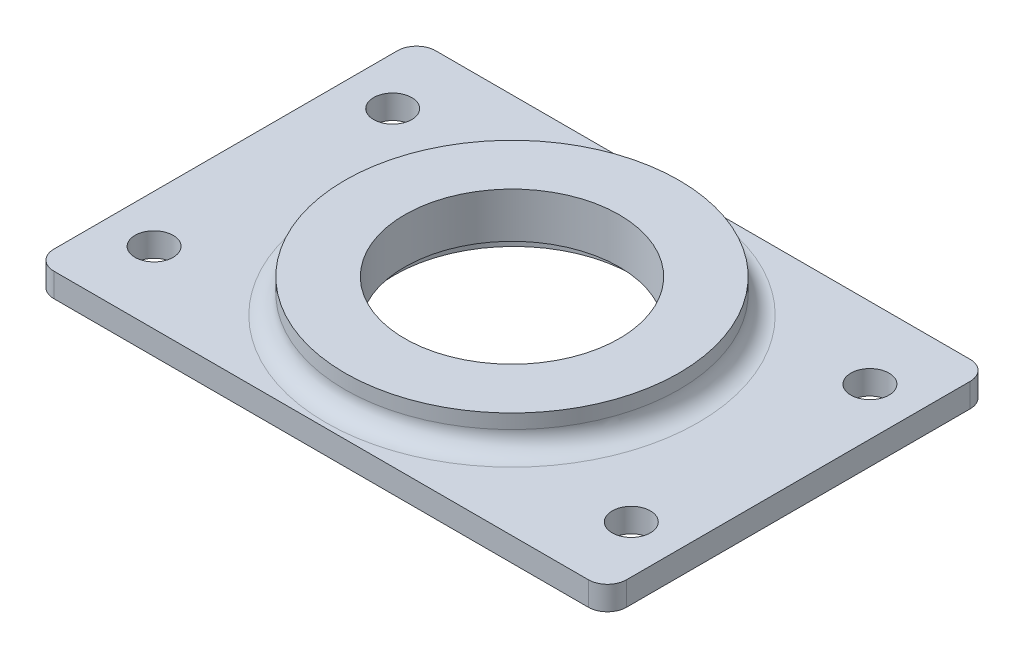
ISO-10303-21;
HEADER;
FILE_DESCRIPTION(('STEP AP214'),'2;1');
FILE_NAME('part.step','',(''),(''),'','','');
FILE_SCHEMA(('AUTOMOTIVE_DESIGN { 1 0 10303 214 1 1 1 1 }'));
ENDSEC;
DATA;
#1=APPLICATION_CONTEXT('core data for automotive mechanical design processes');
#2=APPLICATION_PROTOCOL_DEFINITION('international standard','automotive_design',2000,#1);
#3=PRODUCT_CONTEXT('',#1,'mechanical');
#4=PRODUCT('Part','Part','',(#3));
#5=PRODUCT_RELATED_PRODUCT_CATEGORY('part','',(#4));
#6=PRODUCT_DEFINITION_FORMATION('','',#4);
#7=PRODUCT_DEFINITION_CONTEXT('part definition',#1,'design');
#8=PRODUCT_DEFINITION('design','',#6,#7);
#9=PRODUCT_DEFINITION_SHAPE('','',#8);
#10=(LENGTH_UNIT() NAMED_UNIT(*) SI_UNIT(.MILLI.,.METRE.));
#11=(NAMED_UNIT(*) PLANE_ANGLE_UNIT() SI_UNIT($,.RADIAN.));
#12=(NAMED_UNIT(*) SI_UNIT($,.STERADIAN.) SOLID_ANGLE_UNIT());
#13=UNCERTAINTY_MEASURE_WITH_UNIT(LENGTH_MEASURE(1.E-05),#10,'distance_accuracy_value','');
#14=(GEOMETRIC_REPRESENTATION_CONTEXT(3) GLOBAL_UNCERTAINTY_ASSIGNED_CONTEXT((#13)) GLOBAL_UNIT_ASSIGNED_CONTEXT((#10,
#11,#12)) REPRESENTATION_CONTEXT('',''));
#15=CARTESIAN_POINT('',(0.,0.,0.));
#16=DIRECTION('',(0.,0.,1.));
#17=DIRECTION('',(1.,0.,0.));
#18=AXIS2_PLACEMENT_3D('',#15,#16,#17);
#19=CARTESIAN_POINT('',(38.1,3.175,-25.4));
#20=DIRECTION('',(0.,-1.,0.));
#21=DIRECTION('',(0.,0.,-1.));
#22=AXIS2_PLACEMENT_3D('',#19,#20,#21);
#23=CYLINDRICAL_SURFACE('',#22,14.2748);
#24=CARTESIAN_POINT('',(38.1,7.62,-25.4));
#25=DIRECTION('',(0.,-1.,0.));
#26=DIRECTION('',(0.,0.,-1.));
#27=AXIS2_PLACEMENT_3D('',#24,#25,#26);
#28=CIRCLE('',#27,14.2748);
#29=CARTESIAN_POINT('',(38.1,7.62,-39.6748));
#30=VERTEX_POINT('',#29);
#31=EDGE_CURVE('E135',#30,#30,#28,.T.);
#32=ORIENTED_EDGE('',*,*,#31,.F.);
#33=EDGE_LOOP('',(#32));
#34=FACE_BOUND('',#33,.T.);
#35=CARTESIAN_POINT('',(38.1,1.6002,-25.4));
#36=DIRECTION('',(0.,-1.,0.));
#37=DIRECTION('',(0.,0.,-1.));
#38=AXIS2_PLACEMENT_3D('',#35,#36,#37);
#39=CIRCLE('',#38,14.2748);
#40=CARTESIAN_POINT('',(38.1,1.6002,-39.6748));
#41=VERTEX_POINT('',#40);
#42=EDGE_CURVE('E144',#41,#41,#39,.T.);
#43=ORIENTED_EDGE('',*,*,#42,.T.);
#44=EDGE_LOOP('',(#43));
#45=FACE_BOUND('',#44,.T.);
#46=ADVANCED_FACE('F34',(#34,#45),#23,.F.);
#47=CARTESIAN_POINT('',(0.,3.175,0.));
#48=DIRECTION('',(0.,-1.,0.));
#49=DIRECTION('',(0.,0.,-1.));
#50=AXIS2_PLACEMENT_3D('',#47,#48,#49);
#51=PLANE('',#50);
#52=CARTESIAN_POINT('',(6.35,3.175,-41.275));
#53=DIRECTION('',(0.,1.,0.));
#54=DIRECTION('',(0.,0.,1.));
#55=AXIS2_PLACEMENT_3D('',#52,#53,#54);
#56=CIRCLE('',#55,2.54);
#57=CARTESIAN_POINT('',(6.35,3.175,-38.735));
#58=VERTEX_POINT('',#57);
#59=EDGE_CURVE('E209',#58,#58,#56,.T.);
#60=ORIENTED_EDGE('',*,*,#59,.F.);
#61=EDGE_LOOP('',(#60));
#62=FACE_BOUND('',#61,.T.);
#63=CARTESIAN_POINT('',(6.35,3.175,-9.525));
#64=DIRECTION('',(0.,1.,0.));
#65=DIRECTION('',(0.,0.,1.));
#66=AXIS2_PLACEMENT_3D('',#63,#64,#65);
#67=CIRCLE('',#66,2.54);
#68=CARTESIAN_POINT('',(6.35,3.175,-6.985));
#69=VERTEX_POINT('',#68);
#70=EDGE_CURVE('E215',#69,#69,#67,.T.);
#71=ORIENTED_EDGE('',*,*,#70,.F.);
#72=EDGE_LOOP('',(#71));
#73=FACE_BOUND('',#72,.T.);
#74=CARTESIAN_POINT('',(69.85,3.175,-9.525));
#75=DIRECTION('',(0.,1.,0.));
#76=DIRECTION('',(0.,0.,1.));
#77=AXIS2_PLACEMENT_3D('',#74,#75,#76);
#78=CIRCLE('',#77,2.54);
#79=CARTESIAN_POINT('',(69.85,3.175,-6.985));
#80=VERTEX_POINT('',#79);
#81=EDGE_CURVE('E221',#80,#80,#78,.T.);
#82=ORIENTED_EDGE('',*,*,#81,.F.);
#83=EDGE_LOOP('',(#82));
#84=FACE_BOUND('',#83,.T.);
#85=CARTESIAN_POINT('',(69.85,3.175,-41.275));
#86=DIRECTION('',(0.,1.,0.));
#87=DIRECTION('',(0.,0.,1.));
#88=AXIS2_PLACEMENT_3D('',#85,#86,#87);
#89=CIRCLE('',#88,2.54);
#90=CARTESIAN_POINT('',(69.85,3.175,-38.735));
#91=VERTEX_POINT('',#90);
#92=EDGE_CURVE('E203',#91,#91,#89,.T.);
#93=ORIENTED_EDGE('',*,*,#92,.F.);
#94=EDGE_LOOP('',(#93));
#95=FACE_BOUND('',#94,.T.);
#96=CARTESIAN_POINT('',(38.1,3.175,-25.4));
#97=DIRECTION('',(0.,-1.,0.));
#98=DIRECTION('',(0.,0.,-1.));
#99=AXIS2_PLACEMENT_3D('',#96,#97,#98);
#100=CIRCLE('',#99,24.765);
#101=CARTESIAN_POINT('',(38.1,3.175,-50.165));
#102=VERTEX_POINT('',#101);
#103=EDGE_CURVE('E151',#102,#102,#100,.T.);
#104=ORIENTED_EDGE('',*,*,#103,.T.);
#105=EDGE_LOOP('',(#104));
#106=FACE_BOUND('',#105,.T.);
#107=DIRECTION('',(-1.,0.,0.));
#108=VECTOR('',#107,1.);
#109=CARTESIAN_POINT('',(0.,3.175,-50.8));
#110=LINE('',#109,#108);
#111=CARTESIAN_POINT('',(73.66,3.175,-50.8));
#112=VERTEX_POINT('',#111);
#113=CARTESIAN_POINT('',(2.54,3.175,-50.8));
#114=VERTEX_POINT('',#113);
#115=EDGE_CURVE('E138',#112,#114,#110,.T.);
#116=ORIENTED_EDGE('',*,*,#115,.T.);
#117=CARTESIAN_POINT('',(2.54,3.175,-48.26));
#118=DIRECTION('',(0.,-1.,0.));
#119=DIRECTION('',(0.,0.,-1.));
#120=AXIS2_PLACEMENT_3D('',#117,#118,#119);
#121=CIRCLE('',#120,2.54);
#122=CARTESIAN_POINT('',(0.,3.175,-48.26));
#123=VERTEX_POINT('',#122);
#124=EDGE_CURVE('E166',#114,#123,#121,.F.);
#125=ORIENTED_EDGE('',*,*,#124,.T.);
#126=DIRECTION('',(0.,0.,1.));
#127=VECTOR('',#126,1.);
#128=CARTESIAN_POINT('',(0.,3.175,0.));
#129=LINE('',#128,#127);
#130=CARTESIAN_POINT('',(0.,3.175,-2.54));
#131=VERTEX_POINT('',#130);
#132=EDGE_CURVE('E121',#123,#131,#129,.T.);
#133=ORIENTED_EDGE('',*,*,#132,.T.);
#134=CARTESIAN_POINT('',(2.54,3.175,-2.54));
#135=DIRECTION('',(0.,-1.,0.));
#136=DIRECTION('',(0.,0.,-1.));
#137=AXIS2_PLACEMENT_3D('',#134,#135,#136);
#138=CIRCLE('',#137,2.54);
#139=CARTESIAN_POINT('',(2.54,3.175,0.));
#140=VERTEX_POINT('',#139);
#141=EDGE_CURVE('E162',#131,#140,#138,.F.);
#142=ORIENTED_EDGE('',*,*,#141,.T.);
#143=DIRECTION('',(1.,0.,0.));
#144=VECTOR('',#143,1.);
#145=CARTESIAN_POINT('',(0.,3.175,0.));
#146=LINE('',#145,#144);
#147=CARTESIAN_POINT('',(73.66,3.175,0.));
#148=VERTEX_POINT('',#147);
#149=EDGE_CURVE('E175',#140,#148,#146,.T.);
#150=ORIENTED_EDGE('',*,*,#149,.T.);
#151=CARTESIAN_POINT('',(73.66,3.175,-2.54));
#152=DIRECTION('',(0.,-1.,0.));
#153=DIRECTION('',(0.,0.,-1.));
#154=AXIS2_PLACEMENT_3D('',#151,#152,#153);
#155=CIRCLE('',#154,2.54);
#156=CARTESIAN_POINT('',(76.2,3.175,-2.54));
#157=VERTEX_POINT('',#156);
#158=EDGE_CURVE('E56',#148,#157,#155,.F.);
#159=ORIENTED_EDGE('',*,*,#158,.T.);
#160=DIRECTION('',(0.,0.,-1.));
#161=VECTOR('',#160,1.);
#162=CARTESIAN_POINT('',(76.2,3.175,0.));
#163=LINE('',#162,#161);
#164=CARTESIAN_POINT('',(76.2,3.175,-48.26));
#165=VERTEX_POINT('',#164);
#166=EDGE_CURVE('E181',#157,#165,#163,.T.);
#167=ORIENTED_EDGE('',*,*,#166,.T.);
#168=CARTESIAN_POINT('',(73.66,3.175,-48.26));
#169=DIRECTION('',(0.,-1.,0.));
#170=DIRECTION('',(0.,0.,-1.));
#171=AXIS2_PLACEMENT_3D('',#168,#169,#170);
#172=CIRCLE('',#171,2.54);
#173=EDGE_CURVE('E164',#165,#112,#172,.F.);
#174=ORIENTED_EDGE('',*,*,#173,.T.);
#175=EDGE_LOOP('',(#116,#125,#133,#142,#150,#159,#167,#174));
#176=FACE_BOUND('',#175,.T.);
#177=ADVANCED_FACE('F179',(#62,#73,#84,#95,#106,#176),#51,.F.);
#178=CARTESIAN_POINT('',(0.,0.,0.));
#179=DIRECTION('',(0.,-1.,0.));
#180=DIRECTION('',(0.,0.,-1.));
#181=AXIS2_PLACEMENT_3D('',#178,#179,#180);
#182=PLANE('',#181);
#183=CARTESIAN_POINT('',(6.35,0.,-41.275));
#184=DIRECTION('',(0.,1.,0.));
#185=DIRECTION('',(0.,0.,1.));
#186=AXIS2_PLACEMENT_3D('',#183,#184,#185);
#187=CIRCLE('',#186,2.54);
#188=CARTESIAN_POINT('',(6.35,0.,-38.735));
#189=VERTEX_POINT('',#188);
#190=EDGE_CURVE('E212',#189,#189,#187,.T.);
#191=ORIENTED_EDGE('',*,*,#190,.T.);
#192=EDGE_LOOP('',(#191));
#193=FACE_BOUND('',#192,.T.);
#194=CARTESIAN_POINT('',(6.35,0.,-9.525));
#195=DIRECTION('',(0.,1.,0.));
#196=DIRECTION('',(0.,0.,1.));
#197=AXIS2_PLACEMENT_3D('',#194,#195,#196);
#198=CIRCLE('',#197,2.54);
#199=CARTESIAN_POINT('',(6.35,0.,-6.985));
#200=VERTEX_POINT('',#199);
#201=EDGE_CURVE('E218',#200,#200,#198,.T.);
#202=ORIENTED_EDGE('',*,*,#201,.T.);
#203=EDGE_LOOP('',(#202));
#204=FACE_BOUND('',#203,.T.);
#205=CARTESIAN_POINT('',(69.85,0.,-9.525));
#206=DIRECTION('',(0.,1.,0.));
#207=DIRECTION('',(0.,0.,1.));
#208=AXIS2_PLACEMENT_3D('',#205,#206,#207);
#209=CIRCLE('',#208,2.54);
#210=CARTESIAN_POINT('',(69.85,0.,-6.985));
#211=VERTEX_POINT('',#210);
#212=EDGE_CURVE('E206',#211,#211,#209,.T.);
#213=ORIENTED_EDGE('',*,*,#212,.T.);
#214=EDGE_LOOP('',(#213));
#215=FACE_BOUND('',#214,.T.);
#216=CARTESIAN_POINT('',(69.85,0.,-41.275));
#217=DIRECTION('',(0.,1.,0.));
#218=DIRECTION('',(0.,0.,1.));
#219=AXIS2_PLACEMENT_3D('',#216,#217,#218);
#220=CIRCLE('',#219,2.54);
#221=CARTESIAN_POINT('',(69.85,0.,-38.735));
#222=VERTEX_POINT('',#221);
#223=EDGE_CURVE('E200',#222,#222,#220,.T.);
#224=ORIENTED_EDGE('',*,*,#223,.T.);
#225=EDGE_LOOP('',(#224));
#226=FACE_BOUND('',#225,.T.);
#227=CARTESIAN_POINT('',(38.3325078490202,0.,-25.4));
#228=DIRECTION('',(0.,-1.,0.));
#229=DIRECTION('',(0.,0.,-1.));
#230=AXIS2_PLACEMENT_3D('',#227,#228,#229);
#231=CIRCLE('',#230,15.8623);
#232=CARTESIAN_POINT('',(38.3325078490202,0.,-41.2623));
#233=VERTEX_POINT('',#232);
#234=EDGE_CURVE('E197',#233,#233,#231,.T.);
#235=ORIENTED_EDGE('',*,*,#234,.F.);
#236=EDGE_LOOP('',(#235));
#237=FACE_BOUND('',#236,.T.);
#238=DIRECTION('',(0.,0.,1.));
#239=VECTOR('',#238,1.);
#240=CARTESIAN_POINT('',(0.,0.,0.));
#241=LINE('',#240,#239);
#242=CARTESIAN_POINT('',(0.,0.,-48.26));
#243=VERTEX_POINT('',#242);
#244=CARTESIAN_POINT('',(0.,0.,-2.54));
#245=VERTEX_POINT('',#244);
#246=EDGE_CURVE('E118',#243,#245,#241,.T.);
#247=ORIENTED_EDGE('',*,*,#246,.F.);
#248=CARTESIAN_POINT('',(2.54,0.,-48.26));
#249=DIRECTION('',(0.,-1.,0.));
#250=DIRECTION('',(0.,0.,-1.));
#251=AXIS2_PLACEMENT_3D('',#248,#249,#250);
#252=CIRCLE('',#251,2.54);
#253=CARTESIAN_POINT('',(2.54,0.,-50.8));
#254=VERTEX_POINT('',#253);
#255=EDGE_CURVE('E101',#243,#254,#252,.T.);
#256=ORIENTED_EDGE('',*,*,#255,.T.);
#257=DIRECTION('',(-1.,0.,0.));
#258=VECTOR('',#257,1.);
#259=CARTESIAN_POINT('',(0.,0.,-50.8));
#260=LINE('',#259,#258);
#261=CARTESIAN_POINT('',(73.66,0.,-50.8));
#262=VERTEX_POINT('',#261);
#263=EDGE_CURVE('E142',#262,#254,#260,.T.);
#264=ORIENTED_EDGE('',*,*,#263,.F.);
#265=CARTESIAN_POINT('',(73.66,0.,-48.26));
#266=DIRECTION('',(0.,-1.,0.));
#267=DIRECTION('',(0.,0.,-1.));
#268=AXIS2_PLACEMENT_3D('',#265,#266,#267);
#269=CIRCLE('',#268,2.54);
#270=CARTESIAN_POINT('',(76.2,0.,-48.26));
#271=VERTEX_POINT('',#270);
#272=EDGE_CURVE('E112',#262,#271,#269,.T.);
#273=ORIENTED_EDGE('',*,*,#272,.T.);
#274=DIRECTION('',(0.,0.,-1.));
#275=VECTOR('',#274,1.);
#276=CARTESIAN_POINT('',(76.2,0.,0.));
#277=LINE('',#276,#275);
#278=CARTESIAN_POINT('',(76.2,0.,-2.54));
#279=VERTEX_POINT('',#278);
#280=EDGE_CURVE('E132',#279,#271,#277,.T.);
#281=ORIENTED_EDGE('',*,*,#280,.F.);
#282=CARTESIAN_POINT('',(73.66,0.,-2.54));
#283=DIRECTION('',(0.,-1.,0.));
#284=DIRECTION('',(0.,0.,-1.));
#285=AXIS2_PLACEMENT_3D('',#282,#283,#284);
#286=CIRCLE('',#285,2.54);
#287=CARTESIAN_POINT('',(73.66,0.,0.));
#288=VERTEX_POINT('',#287);
#289=EDGE_CURVE('E122',#279,#288,#286,.T.);
#290=ORIENTED_EDGE('',*,*,#289,.T.);
#291=DIRECTION('',(1.,0.,0.));
#292=VECTOR('',#291,1.);
#293=CARTESIAN_POINT('',(0.,0.,0.));
#294=LINE('',#293,#292);
#295=CARTESIAN_POINT('',(2.54,0.,0.));
#296=VERTEX_POINT('',#295);
#297=EDGE_CURVE('E128',#296,#288,#294,.T.);
#298=ORIENTED_EDGE('',*,*,#297,.F.);
#299=CARTESIAN_POINT('',(2.54,0.,-2.54));
#300=DIRECTION('',(0.,-1.,0.));
#301=DIRECTION('',(0.,0.,-1.));
#302=AXIS2_PLACEMENT_3D('',#299,#300,#301);
#303=CIRCLE('',#302,2.54);
#304=EDGE_CURVE('E127',#296,#245,#303,.T.);
#305=ORIENTED_EDGE('',*,*,#304,.T.);
#306=EDGE_LOOP('',(#247,#256,#264,#273,#281,#290,#298,#305));
#307=FACE_BOUND('',#306,.T.);
#308=ADVANCED_FACE('F125',(#193,#204,#215,#226,#237,#307),#182,.T.);
#309=CARTESIAN_POINT('',(0.,3.175,0.));
#310=DIRECTION('',(1.,0.,0.));
#311=DIRECTION('',(0.,0.,-1.));
#312=AXIS2_PLACEMENT_3D('',#309,#310,#311);
#313=PLANE('',#312);
#314=ORIENTED_EDGE('',*,*,#132,.F.);
#315=DIRECTION('',(0.,-1.,0.));
#316=VECTOR('',#315,1.);
#317=CARTESIAN_POINT('',(0.,3.175,-48.26));
#318=LINE('',#317,#316);
#319=EDGE_CURVE('E105',#123,#243,#318,.T.);
#320=ORIENTED_EDGE('',*,*,#319,.T.);
#321=ORIENTED_EDGE('',*,*,#246,.T.);
#322=DIRECTION('',(0.,-1.,0.));
#323=VECTOR('',#322,1.);
#324=CARTESIAN_POINT('',(0.,3.175,-2.54));
#325=LINE('',#324,#323);
#326=EDGE_CURVE('E123',#245,#131,#325,.F.);
#327=ORIENTED_EDGE('',*,*,#326,.T.);
#328=EDGE_LOOP('',(#314,#320,#321,#327));
#329=FACE_BOUND('',#328,.T.);
#330=ADVANCED_FACE('F117',(#329),#313,.F.);
#331=CARTESIAN_POINT('',(0.,3.175,0.));
#332=DIRECTION('',(0.,0.,-1.));
#333=DIRECTION('',(-1.,0.,0.));
#334=AXIS2_PLACEMENT_3D('',#331,#332,#333);
#335=PLANE('',#334);
#336=ORIENTED_EDGE('',*,*,#149,.F.);
#337=DIRECTION('',(0.,-1.,0.));
#338=VECTOR('',#337,1.);
#339=CARTESIAN_POINT('',(2.54,3.175,0.));
#340=LINE('',#339,#338);
#341=EDGE_CURVE('E11',#140,#296,#340,.T.);
#342=ORIENTED_EDGE('',*,*,#341,.T.);
#343=ORIENTED_EDGE('',*,*,#297,.T.);
#344=DIRECTION('',(0.,-1.,0.));
#345=VECTOR('',#344,1.);
#346=CARTESIAN_POINT('',(73.66,3.175,0.));
#347=LINE('',#346,#345);
#348=EDGE_CURVE('E42',#288,#148,#347,.F.);
#349=ORIENTED_EDGE('',*,*,#348,.T.);
#350=EDGE_LOOP('',(#336,#342,#343,#349));
#351=FACE_BOUND('',#350,.T.);
#352=ADVANCED_FACE('F174',(#351),#335,.F.);
#353=CARTESIAN_POINT('',(76.2,3.175,0.));
#354=DIRECTION('',(-1.,0.,0.));
#355=DIRECTION('',(0.,0.,1.));
#356=AXIS2_PLACEMENT_3D('',#353,#354,#355);
#357=PLANE('',#356);
#358=ORIENTED_EDGE('',*,*,#280,.T.);
#359=DIRECTION('',(0.,-1.,0.));
#360=VECTOR('',#359,1.);
#361=CARTESIAN_POINT('',(76.2,3.175,-48.26));
#362=LINE('',#361,#360);
#363=EDGE_CURVE('E49',#271,#165,#362,.F.);
#364=ORIENTED_EDGE('',*,*,#363,.T.);
#365=ORIENTED_EDGE('',*,*,#166,.F.);
#366=DIRECTION('',(0.,-1.,0.));
#367=VECTOR('',#366,1.);
#368=CARTESIAN_POINT('',(76.2,3.175,-2.54));
#369=LINE('',#368,#367);
#370=EDGE_CURVE('E168',#157,#279,#369,.T.);
#371=ORIENTED_EDGE('',*,*,#370,.T.);
#372=EDGE_LOOP('',(#358,#364,#365,#371));
#373=FACE_BOUND('',#372,.T.);
#374=ADVANCED_FACE('F185',(#373),#357,.F.);
#375=CARTESIAN_POINT('',(0.,3.175,-50.8));
#376=DIRECTION('',(0.,0.,1.));
#377=DIRECTION('',(1.,0.,0.));
#378=AXIS2_PLACEMENT_3D('',#375,#376,#377);
#379=PLANE('',#378);
#380=ORIENTED_EDGE('',*,*,#263,.T.);
#381=DIRECTION('',(0.,-1.,0.));
#382=VECTOR('',#381,1.);
#383=CARTESIAN_POINT('',(2.54,3.175,-50.8));
#384=LINE('',#383,#382);
#385=EDGE_CURVE('E106',#254,#114,#384,.F.);
#386=ORIENTED_EDGE('',*,*,#385,.T.);
#387=ORIENTED_EDGE('',*,*,#115,.F.);
#388=DIRECTION('',(0.,-1.,0.));
#389=VECTOR('',#388,1.);
#390=CARTESIAN_POINT('',(73.66,3.175,-50.8));
#391=LINE('',#390,#389);
#392=EDGE_CURVE('E111',#112,#262,#391,.T.);
#393=ORIENTED_EDGE('',*,*,#392,.T.);
#394=EDGE_LOOP('',(#380,#386,#387,#393));
#395=FACE_BOUND('',#394,.T.);
#396=ADVANCED_FACE('F192',(#395),#379,.F.);
#397=CARTESIAN_POINT('',(38.1,7.62,-25.4));
#398=DIRECTION('',(0.,-1.,0.));
#399=DIRECTION('',(0.,0.,-1.));
#400=AXIS2_PLACEMENT_3D('',#397,#398,#399);
#401=CYLINDRICAL_SURFACE('',#400,22.225);
#402=CARTESIAN_POINT('',(38.1,5.715,-25.4));
#403=DIRECTION('',(0.,-1.,0.));
#404=DIRECTION('',(0.,0.,-1.));
#405=AXIS2_PLACEMENT_3D('',#402,#403,#404);
#406=CIRCLE('',#405,22.225);
#407=CARTESIAN_POINT('',(38.1,5.715,-47.625));
#408=VERTEX_POINT('',#407);
#409=EDGE_CURVE('E148',#408,#408,#406,.F.);
#410=ORIENTED_EDGE('',*,*,#409,.T.);
#411=EDGE_LOOP('',(#410));
#412=FACE_BOUND('',#411,.T.);
#413=CARTESIAN_POINT('',(38.1,7.62,-25.4));
#414=DIRECTION('',(0.,1.,0.));
#415=DIRECTION('',(0.,0.,1.));
#416=AXIS2_PLACEMENT_3D('',#413,#414,#415);
#417=CIRCLE('',#416,22.225);
#418=CARTESIAN_POINT('',(38.1,7.62,-3.17499999999999));
#419=VERTEX_POINT('',#418);
#420=EDGE_CURVE('E129',#419,#419,#417,.T.);
#421=ORIENTED_EDGE('',*,*,#420,.F.);
#422=EDGE_LOOP('',(#421));
#423=FACE_BOUND('',#422,.T.);
#424=ADVANCED_FACE('F252',(#412,#423),#401,.T.);
#425=CARTESIAN_POINT('',(38.1,7.62,-25.4));
#426=DIRECTION('',(0.,1.,0.));
#427=DIRECTION('',(0.,0.,1.));
#428=AXIS2_PLACEMENT_3D('',#425,#426,#427);
#429=PLANE('',#428);
#430=ORIENTED_EDGE('',*,*,#31,.T.);
#431=EDGE_LOOP('',(#430));
#432=FACE_BOUND('',#431,.T.);
#433=ORIENTED_EDGE('',*,*,#420,.T.);
#434=EDGE_LOOP('',(#433));
#435=FACE_BOUND('',#434,.T.);
#436=ADVANCED_FACE('F255',(#432,#435),#429,.T.);
#437=CARTESIAN_POINT('',(38.3325078490202,1.6002,-25.4));
#438=DIRECTION('',(0.,-1.,0.));
#439=DIRECTION('',(0.,0.,-1.));
#440=AXIS2_PLACEMENT_3D('',#437,#438,#439);
#441=CYLINDRICAL_SURFACE('',#440,15.8623);
#442=CARTESIAN_POINT('',(38.3325078490202,1.6002,-25.4));
#443=DIRECTION('',(0.,-1.,0.));
#444=DIRECTION('',(0.,0.,-1.));
#445=AXIS2_PLACEMENT_3D('',#442,#443,#444);
#446=CIRCLE('',#445,15.8623);
#447=CARTESIAN_POINT('',(38.3325078490202,1.6002,-41.2623));
#448=VERTEX_POINT('',#447);
#449=EDGE_CURVE('E147',#448,#448,#446,.T.);
#450=ORIENTED_EDGE('',*,*,#449,.F.);
#451=EDGE_LOOP('',(#450));
#452=FACE_BOUND('',#451,.T.);
#453=ORIENTED_EDGE('',*,*,#234,.T.);
#454=EDGE_LOOP('',(#453));
#455=FACE_BOUND('',#454,.T.);
#456=ADVANCED_FACE('F260',(#452,#455),#441,.F.);
#457=CARTESIAN_POINT('',(38.3325078490202,1.6002,-25.4));
#458=DIRECTION('',(0.,-1.,0.));
#459=DIRECTION('',(0.,0.,-1.));
#460=AXIS2_PLACEMENT_3D('',#457,#458,#459);
#461=PLANE('',#460);
#462=ORIENTED_EDGE('',*,*,#42,.F.);
#463=EDGE_LOOP('',(#462));
#464=FACE_BOUND('',#463,.T.);
#465=ORIENTED_EDGE('',*,*,#449,.T.);
#466=EDGE_LOOP('',(#465));
#467=FACE_BOUND('',#466,.T.);
#468=ADVANCED_FACE('F248',(#464,#467),#461,.T.);
#469=CARTESIAN_POINT('',(38.1,5.715,-25.4));
#470=DIRECTION('',(0.,-1.,0.));
#471=DIRECTION('',(0.,0.,-1.));
#472=AXIS2_PLACEMENT_3D('',#469,#470,#471);
#473=TOROIDAL_SURFACE('',#472,24.765,2.54);
#474=ORIENTED_EDGE('',*,*,#103,.F.);
#475=EDGE_LOOP('',(#474));
#476=FACE_BOUND('',#475,.T.);
#477=ORIENTED_EDGE('',*,*,#409,.F.);
#478=EDGE_LOOP('',(#477));
#479=FACE_BOUND('',#478,.T.);
#480=ADVANCED_FACE('F245',(#476,#479),#473,.F.);
#481=CARTESIAN_POINT('',(2.54,3.175,-48.26));
#482=DIRECTION('',(0.,-1.,0.));
#483=DIRECTION('',(0.,0.,-1.));
#484=AXIS2_PLACEMENT_3D('',#481,#482,#483);
#485=CYLINDRICAL_SURFACE('',#484,2.54);
#486=ORIENTED_EDGE('',*,*,#124,.F.);
#487=ORIENTED_EDGE('',*,*,#385,.F.);
#488=ORIENTED_EDGE('',*,*,#255,.F.);
#489=ORIENTED_EDGE('',*,*,#319,.F.);
#490=EDGE_LOOP('',(#486,#487,#488,#489));
#491=FACE_BOUND('',#490,.T.);
#492=ADVANCED_FACE('F104',(#491),#485,.T.);
#493=CARTESIAN_POINT('',(73.66,3.175,-48.26));
#494=DIRECTION('',(0.,-1.,0.));
#495=DIRECTION('',(0.,0.,-1.));
#496=AXIS2_PLACEMENT_3D('',#493,#494,#495);
#497=CYLINDRICAL_SURFACE('',#496,2.54);
#498=ORIENTED_EDGE('',*,*,#173,.F.);
#499=ORIENTED_EDGE('',*,*,#363,.F.);
#500=ORIENTED_EDGE('',*,*,#272,.F.);
#501=ORIENTED_EDGE('',*,*,#392,.F.);
#502=EDGE_LOOP('',(#498,#499,#500,#501));
#503=FACE_BOUND('',#502,.T.);
#504=ADVANCED_FACE('F189',(#503),#497,.T.);
#505=CARTESIAN_POINT('',(2.54,3.175,-2.54));
#506=DIRECTION('',(0.,-1.,0.));
#507=DIRECTION('',(0.,0.,-1.));
#508=AXIS2_PLACEMENT_3D('',#505,#506,#507);
#509=CYLINDRICAL_SURFACE('',#508,2.54);
#510=ORIENTED_EDGE('',*,*,#141,.F.);
#511=ORIENTED_EDGE('',*,*,#326,.F.);
#512=ORIENTED_EDGE('',*,*,#304,.F.);
#513=ORIENTED_EDGE('',*,*,#341,.F.);
#514=EDGE_LOOP('',(#510,#511,#512,#513));
#515=FACE_BOUND('',#514,.T.);
#516=ADVANCED_FACE('F290',(#515),#509,.T.);
#517=CARTESIAN_POINT('',(73.66,3.175,-2.54));
#518=DIRECTION('',(0.,-1.,0.));
#519=DIRECTION('',(0.,0.,-1.));
#520=AXIS2_PLACEMENT_3D('',#517,#518,#519);
#521=CYLINDRICAL_SURFACE('',#520,2.54);
#522=ORIENTED_EDGE('',*,*,#158,.F.);
#523=ORIENTED_EDGE('',*,*,#348,.F.);
#524=ORIENTED_EDGE('',*,*,#289,.F.);
#525=ORIENTED_EDGE('',*,*,#370,.F.);
#526=EDGE_LOOP('',(#522,#523,#524,#525));
#527=FACE_BOUND('',#526,.T.);
#528=ADVANCED_FACE('F36',(#527),#521,.T.);
#529=CARTESIAN_POINT('',(69.85,0.,-41.275));
#530=DIRECTION('',(0.,1.,0.));
#531=DIRECTION('',(0.,0.,1.));
#532=AXIS2_PLACEMENT_3D('',#529,#530,#531);
#533=CYLINDRICAL_SURFACE('',#532,2.54);
#534=ORIENTED_EDGE('',*,*,#223,.F.);
#535=EDGE_LOOP('',(#534));
#536=FACE_BOUND('',#535,.T.);
#537=ORIENTED_EDGE('',*,*,#92,.T.);
#538=EDGE_LOOP('',(#537));
#539=FACE_BOUND('',#538,.T.);
#540=ADVANCED_FACE('F233',(#536,#539),#533,.F.);
#541=CARTESIAN_POINT('',(69.85,0.,-9.525));
#542=DIRECTION('',(0.,1.,0.));
#543=DIRECTION('',(0.,0.,1.));
#544=AXIS2_PLACEMENT_3D('',#541,#542,#543);
#545=CYLINDRICAL_SURFACE('',#544,2.54);
#546=ORIENTED_EDGE('',*,*,#212,.F.);
#547=EDGE_LOOP('',(#546));
#548=FACE_BOUND('',#547,.T.);
#549=ORIENTED_EDGE('',*,*,#81,.T.);
#550=EDGE_LOOP('',(#549));
#551=FACE_BOUND('',#550,.T.);
#552=ADVANCED_FACE('F229',(#548,#551),#545,.F.);
#553=CARTESIAN_POINT('',(6.35,0.,-9.525));
#554=DIRECTION('',(0.,1.,0.));
#555=DIRECTION('',(0.,0.,1.));
#556=AXIS2_PLACEMENT_3D('',#553,#554,#555);
#557=CYLINDRICAL_SURFACE('',#556,2.54);
#558=ORIENTED_EDGE('',*,*,#201,.F.);
#559=EDGE_LOOP('',(#558));
#560=FACE_BOUND('',#559,.T.);
#561=ORIENTED_EDGE('',*,*,#70,.T.);
#562=EDGE_LOOP('',(#561));
#563=FACE_BOUND('',#562,.T.);
#564=ADVANCED_FACE('F232',(#560,#563),#557,.F.);
#565=CARTESIAN_POINT('',(6.35,0.,-41.275));
#566=DIRECTION('',(0.,1.,0.));
#567=DIRECTION('',(0.,0.,1.));
#568=AXIS2_PLACEMENT_3D('',#565,#566,#567);
#569=CYLINDRICAL_SURFACE('',#568,2.54);
#570=ORIENTED_EDGE('',*,*,#190,.F.);
#571=EDGE_LOOP('',(#570));
#572=FACE_BOUND('',#571,.T.);
#573=ORIENTED_EDGE('',*,*,#59,.T.);
#574=EDGE_LOOP('',(#573));
#575=FACE_BOUND('',#574,.T.);
#576=ADVANCED_FACE('F307',(#572,#575),#569,.F.);
#577=CLOSED_SHELL('',(#46,#177,#308,#330,#352,#374,#396,#424,#436,#456,#468,#480,#492,#504,#516,
#528,#540,#552,#564,#576));
#578=MANIFOLD_SOLID_BREP('B2',#577);
#579=ADVANCED_BREP_SHAPE_REPRESENTATION('',(#18,#578),#14);
#580=SHAPE_DEFINITION_REPRESENTATION(#9,#579);
ENDSEC;
END-ISO-10303-21;
